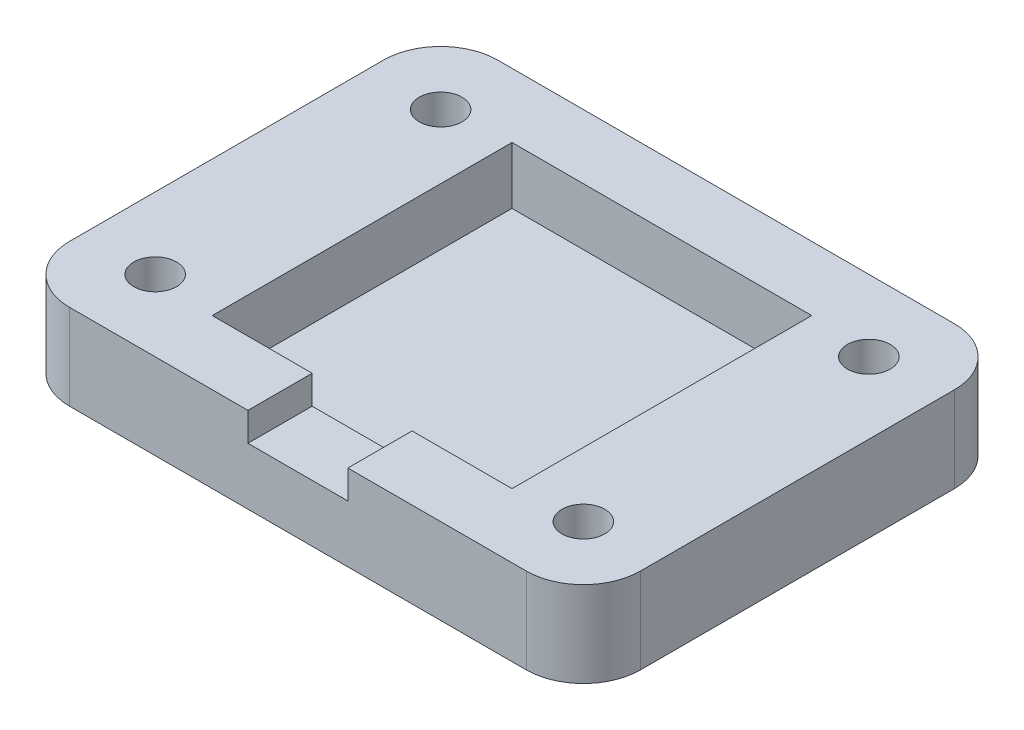
ISO-10303-21;
HEADER;
FILE_DESCRIPTION(('STEP AP214'),'2;1');
FILE_NAME('part.step','',(''),(''),'','','');
FILE_SCHEMA(('AUTOMOTIVE_DESIGN { 1 0 10303 214 1 1 1 1 }'));
ENDSEC;
DATA;
#1=APPLICATION_CONTEXT('core data for automotive mechanical design processes');
#2=APPLICATION_PROTOCOL_DEFINITION('international standard','automotive_design',2000,#1);
#3=PRODUCT_CONTEXT('',#1,'mechanical');
#4=PRODUCT('Part','Part','',(#3));
#5=PRODUCT_RELATED_PRODUCT_CATEGORY('part','',(#4));
#6=PRODUCT_DEFINITION_FORMATION('','',#4);
#7=PRODUCT_DEFINITION_CONTEXT('part definition',#1,'design');
#8=PRODUCT_DEFINITION('design','',#6,#7);
#9=PRODUCT_DEFINITION_SHAPE('','',#8);
#10=(LENGTH_UNIT() NAMED_UNIT(*) SI_UNIT(.MILLI.,.METRE.));
#11=(NAMED_UNIT(*) PLANE_ANGLE_UNIT() SI_UNIT($,.RADIAN.));
#12=(NAMED_UNIT(*) SI_UNIT($,.STERADIAN.) SOLID_ANGLE_UNIT());
#13=UNCERTAINTY_MEASURE_WITH_UNIT(LENGTH_MEASURE(1.E-05),#10,'distance_accuracy_value','');
#14=(GEOMETRIC_REPRESENTATION_CONTEXT(3) GLOBAL_UNCERTAINTY_ASSIGNED_CONTEXT((#13)) GLOBAL_UNIT_ASSIGNED_CONTEXT((#10,
#11,#12)) REPRESENTATION_CONTEXT('',''));
#15=CARTESIAN_POINT('',(0.,0.,0.));
#16=DIRECTION('',(0.,0.,1.));
#17=DIRECTION('',(1.,0.,0.));
#18=AXIS2_PLACEMENT_3D('',#15,#16,#17);
#19=CARTESIAN_POINT('',(0.,6.,0.));
#20=DIRECTION('',(1.,0.,0.));
#21=DIRECTION('',(0.,0.,-1.));
#22=AXIS2_PLACEMENT_3D('',#19,#20,#21);
#23=PLANE('',#22);
#24=DIRECTION('',(0.,0.,1.));
#25=VECTOR('',#24,1.);
#26=CARTESIAN_POINT('',(0.,6.,0.));
#27=LINE('',#26,#25);
#28=CARTESIAN_POINT('',(0.,6.,-26.));
#29=VERTEX_POINT('',#28);
#30=CARTESIAN_POINT('',(0.,6.,-4.));
#31=VERTEX_POINT('',#30);
#32=EDGE_CURVE('E239',#29,#31,#27,.T.);
#33=ORIENTED_EDGE('',*,*,#32,.F.);
#34=DIRECTION('',(0.,-1.,0.));
#35=VECTOR('',#34,1.);
#36=CARTESIAN_POINT('',(0.,6.,-26.));
#37=LINE('',#36,#35);
#38=CARTESIAN_POINT('',(0.,0.,-26.));
#39=VERTEX_POINT('',#38);
#40=EDGE_CURVE('E264',#29,#39,#37,.T.);
#41=ORIENTED_EDGE('',*,*,#40,.T.);
#42=DIRECTION('',(0.,0.,1.));
#43=VECTOR('',#42,1.);
#44=CARTESIAN_POINT('',(0.,0.,0.));
#45=LINE('',#44,#43);
#46=CARTESIAN_POINT('',(0.,0.,-4.));
#47=VERTEX_POINT('',#46);
#48=EDGE_CURVE('E238',#39,#47,#45,.T.);
#49=ORIENTED_EDGE('',*,*,#48,.T.);
#50=DIRECTION('',(0.,-1.,0.));
#51=VECTOR('',#50,1.);
#52=CARTESIAN_POINT('',(0.,6.,-4.));
#53=LINE('',#52,#51);
#54=EDGE_CURVE('E252',#47,#31,#53,.F.);
#55=ORIENTED_EDGE('',*,*,#54,.T.);
#56=EDGE_LOOP('',(#33,#41,#49,#55));
#57=FACE_BOUND('',#56,.T.);
#58=ADVANCED_FACE('F35',(#57),#23,.F.);
#59=CARTESIAN_POINT('',(0.,6.,0.));
#60=DIRECTION('',(0.,0.,-1.));
#61=DIRECTION('',(-1.,0.,0.));
#62=AXIS2_PLACEMENT_3D('',#59,#60,#61);
#63=PLANE('',#62);
#64=DIRECTION('',(1.,0.,0.));
#65=VECTOR('',#64,1.);
#66=CARTESIAN_POINT('',(16.5,4.,0.));
#67=LINE('',#66,#65);
#68=CARTESIAN_POINT('',(16.5,4.,0.));
#69=VERTEX_POINT('',#68);
#70=CARTESIAN_POINT('',(23.5,4.,0.));
#71=VERTEX_POINT('',#70);
#72=EDGE_CURVE('E162',#69,#71,#67,.T.);
#73=ORIENTED_EDGE('',*,*,#72,.F.);
#74=DIRECTION('',(0.,1.,0.));
#75=VECTOR('',#74,1.);
#76=CARTESIAN_POINT('',(16.5,4.,0.));
#77=LINE('',#76,#75);
#78=CARTESIAN_POINT('',(16.5,6.,0.));
#79=VERTEX_POINT('',#78);
#80=EDGE_CURVE('E148',#69,#79,#77,.T.);
#81=ORIENTED_EDGE('',*,*,#80,.T.);
#82=DIRECTION('',(1.,0.,0.));
#83=VECTOR('',#82,1.);
#84=CARTESIAN_POINT('',(0.,6.,0.));
#85=LINE('',#84,#83);
#86=CARTESIAN_POINT('',(4.,6.,0.));
#87=VERTEX_POINT('',#86);
#88=EDGE_CURVE('E244',#87,#79,#85,.T.);
#89=ORIENTED_EDGE('',*,*,#88,.F.);
#90=DIRECTION('',(0.,-1.,0.));
#91=VECTOR('',#90,1.);
#92=CARTESIAN_POINT('',(4.,6.,0.));
#93=LINE('',#92,#91);
#94=CARTESIAN_POINT('',(4.,0.,0.));
#95=VERTEX_POINT('',#94);
#96=EDGE_CURVE('E43',#87,#95,#93,.T.);
#97=ORIENTED_EDGE('',*,*,#96,.T.);
#98=DIRECTION('',(1.,0.,0.));
#99=VECTOR('',#98,1.);
#100=CARTESIAN_POINT('',(0.,0.,0.));
#101=LINE('',#100,#99);
#102=CARTESIAN_POINT('',(36.,0.,0.));
#103=VERTEX_POINT('',#102);
#104=EDGE_CURVE('E255',#95,#103,#101,.T.);
#105=ORIENTED_EDGE('',*,*,#104,.T.);
#106=DIRECTION('',(0.,-1.,0.));
#107=VECTOR('',#106,1.);
#108=CARTESIAN_POINT('',(36.,6.,0.));
#109=LINE('',#108,#107);
#110=CARTESIAN_POINT('',(36.,6.,0.));
#111=VERTEX_POINT('',#110);
#112=EDGE_CURVE('E11',#103,#111,#109,.F.);
#113=ORIENTED_EDGE('',*,*,#112,.T.);
#114=CARTESIAN_POINT('',(23.5,6.,0.));
#115=VERTEX_POINT('',#114);
#116=EDGE_CURVE('E242',#115,#111,#85,.T.);
#117=ORIENTED_EDGE('',*,*,#116,.F.);
#118=DIRECTION('',(0.,1.,0.));
#119=VECTOR('',#118,1.);
#120=CARTESIAN_POINT('',(23.5,4.,0.));
#121=LINE('',#120,#119);
#122=EDGE_CURVE('E158',#71,#115,#121,.T.);
#123=ORIENTED_EDGE('',*,*,#122,.F.);
#124=EDGE_LOOP('',(#73,#81,#89,#97,#105,#113,#117,#123));
#125=FACE_BOUND('',#124,.T.);
#126=ADVANCED_FACE('F168',(#125),#63,.F.);
#127=CARTESIAN_POINT('',(40.,6.,0.));
#128=DIRECTION('',(-1.,0.,0.));
#129=DIRECTION('',(0.,0.,1.));
#130=AXIS2_PLACEMENT_3D('',#127,#128,#129);
#131=PLANE('',#130);
#132=DIRECTION('',(0.,0.,-1.));
#133=VECTOR('',#132,1.);
#134=CARTESIAN_POINT('',(40.,0.,0.));
#135=LINE('',#134,#133);
#136=CARTESIAN_POINT('',(40.,0.,-4.));
#137=VERTEX_POINT('',#136);
#138=CARTESIAN_POINT('',(40.,0.,-26.));
#139=VERTEX_POINT('',#138);
#140=EDGE_CURVE('E258',#137,#139,#135,.T.);
#141=ORIENTED_EDGE('',*,*,#140,.T.);
#142=DIRECTION('',(0.,-1.,0.));
#143=VECTOR('',#142,1.);
#144=CARTESIAN_POINT('',(40.,6.,-26.));
#145=LINE('',#144,#143);
#146=CARTESIAN_POINT('',(40.,6.,-26.));
#147=VERTEX_POINT('',#146);
#148=EDGE_CURVE('E291',#139,#147,#145,.F.);
#149=ORIENTED_EDGE('',*,*,#148,.T.);
#150=DIRECTION('',(0.,0.,-1.));
#151=VECTOR('',#150,1.);
#152=CARTESIAN_POINT('',(40.,6.,0.));
#153=LINE('',#152,#151);
#154=CARTESIAN_POINT('',(40.,6.,-4.));
#155=VERTEX_POINT('',#154);
#156=EDGE_CURVE('E246',#155,#147,#153,.T.);
#157=ORIENTED_EDGE('',*,*,#156,.F.);
#158=DIRECTION('',(0.,-1.,0.));
#159=VECTOR('',#158,1.);
#160=CARTESIAN_POINT('',(40.,6.,-4.));
#161=LINE('',#160,#159);
#162=EDGE_CURVE('E288',#155,#137,#161,.T.);
#163=ORIENTED_EDGE('',*,*,#162,.T.);
#164=EDGE_LOOP('',(#141,#149,#157,#163));
#165=FACE_BOUND('',#164,.T.);
#166=ADVANCED_FACE('F308',(#165),#131,.F.);
#167=CARTESIAN_POINT('',(0.,6.,-30.));
#168=DIRECTION('',(0.,0.,1.));
#169=DIRECTION('',(1.,0.,0.));
#170=AXIS2_PLACEMENT_3D('',#167,#168,#169);
#171=PLANE('',#170);
#172=DIRECTION('',(-1.,0.,0.));
#173=VECTOR('',#172,1.);
#174=CARTESIAN_POINT('',(0.,0.,-30.));
#175=LINE('',#174,#173);
#176=CARTESIAN_POINT('',(36.,0.,-30.));
#177=VERTEX_POINT('',#176);
#178=CARTESIAN_POINT('',(4.,0.,-30.));
#179=VERTEX_POINT('',#178);
#180=EDGE_CURVE('E243',#177,#179,#175,.T.);
#181=ORIENTED_EDGE('',*,*,#180,.T.);
#182=DIRECTION('',(0.,-1.,0.));
#183=VECTOR('',#182,1.);
#184=CARTESIAN_POINT('',(4.,6.,-30.));
#185=LINE('',#184,#183);
#186=CARTESIAN_POINT('',(4.,6.,-30.));
#187=VERTEX_POINT('',#186);
#188=EDGE_CURVE('E278',#179,#187,#185,.F.);
#189=ORIENTED_EDGE('',*,*,#188,.T.);
#190=DIRECTION('',(-1.,0.,0.));
#191=VECTOR('',#190,1.);
#192=CARTESIAN_POINT('',(0.,6.,-30.));
#193=LINE('',#192,#191);
#194=CARTESIAN_POINT('',(36.,6.,-30.));
#195=VERTEX_POINT('',#194);
#196=EDGE_CURVE('E249',#195,#187,#193,.T.);
#197=ORIENTED_EDGE('',*,*,#196,.F.);
#198=DIRECTION('',(0.,-1.,0.));
#199=VECTOR('',#198,1.);
#200=CARTESIAN_POINT('',(36.,6.,-30.));
#201=LINE('',#200,#199);
#202=EDGE_CURVE('E275',#195,#177,#201,.T.);
#203=ORIENTED_EDGE('',*,*,#202,.T.);
#204=EDGE_LOOP('',(#181,#189,#197,#203));
#205=FACE_BOUND('',#204,.T.);
#206=ADVANCED_FACE('F320',(#205),#171,.F.);
#207=CARTESIAN_POINT('',(0.,6.,0.));
#208=DIRECTION('',(0.,-1.,0.));
#209=DIRECTION('',(0.,0.,-1.));
#210=AXIS2_PLACEMENT_3D('',#207,#208,#209);
#211=PLANE('',#210);
#212=ORIENTED_EDGE('',*,*,#88,.T.);
#213=DIRECTION('',(0.,0.,1.));
#214=VECTOR('',#213,1.);
#215=CARTESIAN_POINT('',(16.5,6.,-4.5));
#216=LINE('',#215,#214);
#217=CARTESIAN_POINT('',(16.5,6.,-4.5));
#218=VERTEX_POINT('',#217);
#219=EDGE_CURVE('E153',#218,#79,#216,.T.);
#220=ORIENTED_EDGE('',*,*,#219,.F.);
#221=DIRECTION('',(1.,0.,0.));
#222=VECTOR('',#221,1.);
#223=CARTESIAN_POINT('',(9.5,6.,-4.5));
#224=LINE('',#223,#222);
#225=CARTESIAN_POINT('',(9.5,6.,-4.5));
#226=VERTEX_POINT('',#225);
#227=EDGE_CURVE('E198',#226,#218,#224,.T.);
#228=ORIENTED_EDGE('',*,*,#227,.F.);
#229=DIRECTION('',(0.,0.,1.));
#230=VECTOR('',#229,1.);
#231=CARTESIAN_POINT('',(9.5,6.,-4.5));
#232=LINE('',#231,#230);
#233=CARTESIAN_POINT('',(9.5,6.,-25.5));
#234=VERTEX_POINT('',#233);
#235=EDGE_CURVE('E58',#234,#226,#232,.T.);
#236=ORIENTED_EDGE('',*,*,#235,.F.);
#237=DIRECTION('',(-1.,0.,0.));
#238=VECTOR('',#237,1.);
#239=CARTESIAN_POINT('',(9.5,6.,-25.5));
#240=LINE('',#239,#238);
#241=CARTESIAN_POINT('',(30.5,6.,-25.5));
#242=VERTEX_POINT('',#241);
#243=EDGE_CURVE('E186',#242,#234,#240,.T.);
#244=ORIENTED_EDGE('',*,*,#243,.F.);
#245=DIRECTION('',(0.,0.,-1.));
#246=VECTOR('',#245,1.);
#247=CARTESIAN_POINT('',(30.5,6.,-4.5));
#248=LINE('',#247,#246);
#249=CARTESIAN_POINT('',(30.5,6.,-4.5));
#250=VERTEX_POINT('',#249);
#251=EDGE_CURVE('E201',#250,#242,#248,.T.);
#252=ORIENTED_EDGE('',*,*,#251,.F.);
#253=CARTESIAN_POINT('',(23.5,6.,-4.5));
#254=VERTEX_POINT('',#253);
#255=EDGE_CURVE('E197',#254,#250,#224,.T.);
#256=ORIENTED_EDGE('',*,*,#255,.F.);
#257=DIRECTION('',(0.,0.,-1.));
#258=VECTOR('',#257,1.);
#259=CARTESIAN_POINT('',(23.5,6.,-4.5));
#260=LINE('',#259,#258);
#261=EDGE_CURVE('E166',#115,#254,#260,.T.);
#262=ORIENTED_EDGE('',*,*,#261,.F.);
#263=ORIENTED_EDGE('',*,*,#116,.T.);
#264=CARTESIAN_POINT('',(36.,6.,-4.));
#265=DIRECTION('',(0.,-1.,0.));
#266=DIRECTION('',(0.,0.,-1.));
#267=AXIS2_PLACEMENT_3D('',#264,#265,#266);
#268=CIRCLE('',#267,4.);
#269=EDGE_CURVE('E282',#111,#155,#268,.F.);
#270=ORIENTED_EDGE('',*,*,#269,.T.);
#271=ORIENTED_EDGE('',*,*,#156,.T.);
#272=CARTESIAN_POINT('',(36.,6.,-26.));
#273=DIRECTION('',(0.,-1.,0.));
#274=DIRECTION('',(0.,0.,-1.));
#275=AXIS2_PLACEMENT_3D('',#272,#273,#274);
#276=CIRCLE('',#275,4.);
#277=EDGE_CURVE('E284',#147,#195,#276,.F.);
#278=ORIENTED_EDGE('',*,*,#277,.T.);
#279=ORIENTED_EDGE('',*,*,#196,.T.);
#280=CARTESIAN_POINT('',(4.,6.,-26.));
#281=DIRECTION('',(0.,-1.,0.));
#282=DIRECTION('',(0.,0.,-1.));
#283=AXIS2_PLACEMENT_3D('',#280,#281,#282);
#284=CIRCLE('',#283,4.);
#285=EDGE_CURVE('E286',#187,#29,#284,.F.);
#286=ORIENTED_EDGE('',*,*,#285,.T.);
#287=ORIENTED_EDGE('',*,*,#32,.T.);
#288=CARTESIAN_POINT('',(4.,6.,-4.));
#289=DIRECTION('',(0.,-1.,0.));
#290=DIRECTION('',(0.,0.,-1.));
#291=AXIS2_PLACEMENT_3D('',#288,#289,#290);
#292=CIRCLE('',#291,4.);
#293=EDGE_CURVE('E280',#31,#87,#292,.F.);
#294=ORIENTED_EDGE('',*,*,#293,.T.);
#295=EDGE_LOOP('',(#212,#220,#228,#236,#244,#252,#256,#262,#263,#270,#271,#278,#279,#286,#287,#294));
#296=FACE_BOUND('',#295,.T.);
#297=CARTESIAN_POINT('',(5.,6.,-25.));
#298=DIRECTION('',(0.,1.,0.));
#299=DIRECTION('',(0.,0.,-1.));
#300=AXIS2_PLACEMENT_3D('',#297,#298,#299);
#301=CIRCLE('',#300,1.5);
#302=CARTESIAN_POINT('',(5.,6.,-26.5));
#303=VERTEX_POINT('',#302);
#304=EDGE_CURVE('E215',#303,#303,#301,.T.);
#305=ORIENTED_EDGE('',*,*,#304,.F.);
#306=EDGE_LOOP('',(#305));
#307=FACE_BOUND('',#306,.T.);
#308=CARTESIAN_POINT('',(35.,6.,-5.));
#309=DIRECTION('',(0.,1.,0.));
#310=DIRECTION('',(0.,0.,-1.));
#311=AXIS2_PLACEMENT_3D('',#308,#309,#310);
#312=CIRCLE('',#311,1.5);
#313=CARTESIAN_POINT('',(35.,6.,-6.5));
#314=VERTEX_POINT('',#313);
#315=EDGE_CURVE('E223',#314,#314,#312,.T.);
#316=ORIENTED_EDGE('',*,*,#315,.F.);
#317=EDGE_LOOP('',(#316));
#318=FACE_BOUND('',#317,.T.);
#319=CARTESIAN_POINT('',(35.,6.,-25.));
#320=DIRECTION('',(0.,1.,0.));
#321=DIRECTION('',(0.,0.,1.));
#322=AXIS2_PLACEMENT_3D('',#319,#320,#321);
#323=CIRCLE('',#322,1.5);
#324=CARTESIAN_POINT('',(35.,6.,-23.5));
#325=VERTEX_POINT('',#324);
#326=EDGE_CURVE('E208',#325,#325,#323,.T.);
#327=ORIENTED_EDGE('',*,*,#326,.F.);
#328=EDGE_LOOP('',(#327));
#329=FACE_BOUND('',#328,.T.);
#330=CARTESIAN_POINT('',(5.,6.,-5.));
#331=DIRECTION('',(0.,1.,0.));
#332=DIRECTION('',(0.,0.,1.));
#333=AXIS2_PLACEMENT_3D('',#330,#331,#332);
#334=CIRCLE('',#333,1.5);
#335=CARTESIAN_POINT('',(5.,6.,-3.5));
#336=VERTEX_POINT('',#335);
#337=EDGE_CURVE('E222',#336,#336,#334,.T.);
#338=ORIENTED_EDGE('',*,*,#337,.F.);
#339=EDGE_LOOP('',(#338));
#340=FACE_BOUND('',#339,.T.);
#341=ADVANCED_FACE('F312',(#296,#307,#318,#329,#340),#211,.F.);
#342=CARTESIAN_POINT('',(0.,0.,0.));
#343=DIRECTION('',(0.,-1.,0.));
#344=DIRECTION('',(0.,0.,-1.));
#345=AXIS2_PLACEMENT_3D('',#342,#343,#344);
#346=PLANE('',#345);
#347=CARTESIAN_POINT('',(5.,0.,-25.));
#348=DIRECTION('',(0.,-1.,0.));
#349=DIRECTION('',(0.,0.,-1.));
#350=AXIS2_PLACEMENT_3D('',#347,#348,#349);
#351=CIRCLE('',#350,1.5);
#352=CARTESIAN_POINT('',(5.,0.,-26.5));
#353=VERTEX_POINT('',#352);
#354=EDGE_CURVE('E218',#353,#353,#351,.F.);
#355=ORIENTED_EDGE('',*,*,#354,.T.);
#356=EDGE_LOOP('',(#355));
#357=FACE_BOUND('',#356,.T.);
#358=CARTESIAN_POINT('',(35.,0.,-5.));
#359=DIRECTION('',(0.,-1.,0.));
#360=DIRECTION('',(0.,0.,-1.));
#361=AXIS2_PLACEMENT_3D('',#358,#359,#360);
#362=CIRCLE('',#361,1.5);
#363=CARTESIAN_POINT('',(35.,0.,-6.5));
#364=VERTEX_POINT('',#363);
#365=EDGE_CURVE('E219',#364,#364,#362,.F.);
#366=ORIENTED_EDGE('',*,*,#365,.T.);
#367=EDGE_LOOP('',(#366));
#368=FACE_BOUND('',#367,.T.);
#369=CARTESIAN_POINT('',(35.,0.,-25.));
#370=DIRECTION('',(0.,-1.,0.));
#371=DIRECTION('',(0.,0.,-1.));
#372=AXIS2_PLACEMENT_3D('',#369,#370,#371);
#373=CIRCLE('',#372,1.5);
#374=CARTESIAN_POINT('',(35.,0.,-26.5));
#375=VERTEX_POINT('',#374);
#376=EDGE_CURVE('E226',#375,#375,#373,.F.);
#377=ORIENTED_EDGE('',*,*,#376,.T.);
#378=EDGE_LOOP('',(#377));
#379=FACE_BOUND('',#378,.T.);
#380=CARTESIAN_POINT('',(5.,0.,-5.));
#381=DIRECTION('',(0.,-1.,0.));
#382=DIRECTION('',(0.,0.,-1.));
#383=AXIS2_PLACEMENT_3D('',#380,#381,#382);
#384=CIRCLE('',#383,1.5);
#385=CARTESIAN_POINT('',(5.,0.,-6.5));
#386=VERTEX_POINT('',#385);
#387=EDGE_CURVE('E235',#386,#386,#384,.F.);
#388=ORIENTED_EDGE('',*,*,#387,.T.);
#389=EDGE_LOOP('',(#388));
#390=FACE_BOUND('',#389,.T.);
#391=ORIENTED_EDGE('',*,*,#48,.F.);
#392=CARTESIAN_POINT('',(4.,0.,-26.));
#393=DIRECTION('',(0.,-1.,0.));
#394=DIRECTION('',(0.,0.,-1.));
#395=AXIS2_PLACEMENT_3D('',#392,#393,#394);
#396=CIRCLE('',#395,4.);
#397=EDGE_CURVE('E273',#39,#179,#396,.T.);
#398=ORIENTED_EDGE('',*,*,#397,.T.);
#399=ORIENTED_EDGE('',*,*,#180,.F.);
#400=CARTESIAN_POINT('',(36.,0.,-26.));
#401=DIRECTION('',(0.,-1.,0.));
#402=DIRECTION('',(0.,0.,-1.));
#403=AXIS2_PLACEMENT_3D('',#400,#401,#402);
#404=CIRCLE('',#403,4.);
#405=EDGE_CURVE('E271',#177,#139,#404,.T.);
#406=ORIENTED_EDGE('',*,*,#405,.T.);
#407=ORIENTED_EDGE('',*,*,#140,.F.);
#408=CARTESIAN_POINT('',(36.,0.,-4.));
#409=DIRECTION('',(0.,-1.,0.));
#410=DIRECTION('',(0.,0.,-1.));
#411=AXIS2_PLACEMENT_3D('',#408,#409,#410);
#412=CIRCLE('',#411,4.);
#413=EDGE_CURVE('E269',#137,#103,#412,.T.);
#414=ORIENTED_EDGE('',*,*,#413,.T.);
#415=ORIENTED_EDGE('',*,*,#104,.F.);
#416=CARTESIAN_POINT('',(4.,0.,-4.));
#417=DIRECTION('',(0.,-1.,0.));
#418=DIRECTION('',(0.,0.,-1.));
#419=AXIS2_PLACEMENT_3D('',#416,#417,#418);
#420=CIRCLE('',#419,4.);
#421=EDGE_CURVE('E267',#95,#47,#420,.T.);
#422=ORIENTED_EDGE('',*,*,#421,.T.);
#423=EDGE_LOOP('',(#391,#398,#399,#406,#407,#414,#415,#422));
#424=FACE_BOUND('',#423,.T.);
#425=ADVANCED_FACE('F300',(#357,#368,#379,#390,#424),#346,.T.);
#426=CARTESIAN_POINT('',(5.,-4.24264068711928,-5.));
#427=DIRECTION('',(0.,1.,0.));
#428=DIRECTION('',(0.,0.,1.));
#429=AXIS2_PLACEMENT_3D('',#426,#427,#428);
#430=CYLINDRICAL_SURFACE('',#429,1.5);
#431=ORIENTED_EDGE('',*,*,#337,.T.);
#432=EDGE_LOOP('',(#431));
#433=FACE_BOUND('',#432,.T.);
#434=ORIENTED_EDGE('',*,*,#387,.F.);
#435=EDGE_LOOP('',(#434));
#436=FACE_BOUND('',#435,.T.);
#437=ADVANCED_FACE('F458',(#433,#436),#430,.F.);
#438=CARTESIAN_POINT('',(35.,-4.24264068711928,-25.));
#439=DIRECTION('',(0.,1.,0.));
#440=DIRECTION('',(0.,0.,1.));
#441=AXIS2_PLACEMENT_3D('',#438,#439,#440);
#442=CYLINDRICAL_SURFACE('',#441,1.5);
#443=ORIENTED_EDGE('',*,*,#326,.T.);
#444=EDGE_LOOP('',(#443));
#445=FACE_BOUND('',#444,.T.);
#446=ORIENTED_EDGE('',*,*,#376,.F.);
#447=EDGE_LOOP('',(#446));
#448=FACE_BOUND('',#447,.T.);
#449=ADVANCED_FACE('F454',(#445,#448),#442,.F.);
#450=CARTESIAN_POINT('',(35.,-4.24264068711928,-5.));
#451=DIRECTION('',(0.,1.,0.));
#452=DIRECTION('',(0.,0.,1.));
#453=AXIS2_PLACEMENT_3D('',#450,#451,#452);
#454=CYLINDRICAL_SURFACE('',#453,1.5);
#455=ORIENTED_EDGE('',*,*,#315,.T.);
#456=EDGE_LOOP('',(#455));
#457=FACE_BOUND('',#456,.T.);
#458=ORIENTED_EDGE('',*,*,#365,.F.);
#459=EDGE_LOOP('',(#458));
#460=FACE_BOUND('',#459,.T.);
#461=ADVANCED_FACE('F450',(#457,#460),#454,.F.);
#462=CARTESIAN_POINT('',(5.,-4.24264068711928,-25.));
#463=DIRECTION('',(0.,1.,0.));
#464=DIRECTION('',(0.,0.,1.));
#465=AXIS2_PLACEMENT_3D('',#462,#463,#464);
#466=CYLINDRICAL_SURFACE('',#465,1.5);
#467=ORIENTED_EDGE('',*,*,#304,.T.);
#468=EDGE_LOOP('',(#467));
#469=FACE_BOUND('',#468,.T.);
#470=ORIENTED_EDGE('',*,*,#354,.F.);
#471=EDGE_LOOP('',(#470));
#472=FACE_BOUND('',#471,.T.);
#473=ADVANCED_FACE('F348',(#469,#472),#466,.F.);
#474=CARTESIAN_POINT('',(4.,6.,-26.));
#475=DIRECTION('',(0.,-1.,0.));
#476=DIRECTION('',(0.,0.,-1.));
#477=AXIS2_PLACEMENT_3D('',#474,#475,#476);
#478=CYLINDRICAL_SURFACE('',#477,4.);
#479=ORIENTED_EDGE('',*,*,#285,.F.);
#480=ORIENTED_EDGE('',*,*,#188,.F.);
#481=ORIENTED_EDGE('',*,*,#397,.F.);
#482=ORIENTED_EDGE('',*,*,#40,.F.);
#483=EDGE_LOOP('',(#479,#480,#481,#482));
#484=FACE_BOUND('',#483,.T.);
#485=ADVANCED_FACE('F325',(#484),#478,.T.);
#486=CARTESIAN_POINT('',(36.,6.,-26.));
#487=DIRECTION('',(0.,-1.,0.));
#488=DIRECTION('',(0.,0.,-1.));
#489=AXIS2_PLACEMENT_3D('',#486,#487,#488);
#490=CYLINDRICAL_SURFACE('',#489,4.);
#491=ORIENTED_EDGE('',*,*,#277,.F.);
#492=ORIENTED_EDGE('',*,*,#148,.F.);
#493=ORIENTED_EDGE('',*,*,#405,.F.);
#494=ORIENTED_EDGE('',*,*,#202,.F.);
#495=EDGE_LOOP('',(#491,#492,#493,#494));
#496=FACE_BOUND('',#495,.T.);
#497=ADVANCED_FACE('F317',(#496),#490,.T.);
#498=CARTESIAN_POINT('',(36.,6.,-4.));
#499=DIRECTION('',(0.,-1.,0.));
#500=DIRECTION('',(0.,0.,-1.));
#501=AXIS2_PLACEMENT_3D('',#498,#499,#500);
#502=CYLINDRICAL_SURFACE('',#501,4.);
#503=ORIENTED_EDGE('',*,*,#269,.F.);
#504=ORIENTED_EDGE('',*,*,#112,.F.);
#505=ORIENTED_EDGE('',*,*,#413,.F.);
#506=ORIENTED_EDGE('',*,*,#162,.F.);
#507=EDGE_LOOP('',(#503,#504,#505,#506));
#508=FACE_BOUND('',#507,.T.);
#509=ADVANCED_FACE('F305',(#508),#502,.T.);
#510=CARTESIAN_POINT('',(4.,6.,-4.));
#511=DIRECTION('',(0.,-1.,0.));
#512=DIRECTION('',(0.,0.,-1.));
#513=AXIS2_PLACEMENT_3D('',#510,#511,#512);
#514=CYLINDRICAL_SURFACE('',#513,4.);
#515=ORIENTED_EDGE('',*,*,#293,.F.);
#516=ORIENTED_EDGE('',*,*,#54,.F.);
#517=ORIENTED_EDGE('',*,*,#421,.F.);
#518=ORIENTED_EDGE('',*,*,#96,.F.);
#519=EDGE_LOOP('',(#515,#516,#517,#518));
#520=FACE_BOUND('',#519,.T.);
#521=ADVANCED_FACE('F37',(#520),#514,.T.);
#522=CARTESIAN_POINT('',(9.5,2.,-4.5));
#523=DIRECTION('',(-1.,0.,0.));
#524=DIRECTION('',(0.,0.,1.));
#525=AXIS2_PLACEMENT_3D('',#522,#523,#524);
#526=PLANE('',#525);
#527=ORIENTED_EDGE('',*,*,#235,.T.);
#528=DIRECTION('',(0.,1.,0.));
#529=VECTOR('',#528,1.);
#530=CARTESIAN_POINT('',(9.5,2.,-4.5));
#531=LINE('',#530,#529);
#532=CARTESIAN_POINT('',(9.5,2.,-4.5));
#533=VERTEX_POINT('',#532);
#534=EDGE_CURVE('E195',#533,#226,#531,.T.);
#535=ORIENTED_EDGE('',*,*,#534,.F.);
#536=DIRECTION('',(0.,0.,1.));
#537=VECTOR('',#536,1.);
#538=CARTESIAN_POINT('',(9.5,2.,-4.5));
#539=LINE('',#538,#537);
#540=CARTESIAN_POINT('',(9.5,2.,-25.5));
#541=VERTEX_POINT('',#540);
#542=EDGE_CURVE('E182',#541,#533,#539,.T.);
#543=ORIENTED_EDGE('',*,*,#542,.F.);
#544=DIRECTION('',(0.,1.,0.));
#545=VECTOR('',#544,1.);
#546=CARTESIAN_POINT('',(9.5,2.,-25.5));
#547=LINE('',#546,#545);
#548=EDGE_CURVE('E206',#541,#234,#547,.T.);
#549=ORIENTED_EDGE('',*,*,#548,.T.);
#550=EDGE_LOOP('',(#527,#535,#543,#549));
#551=FACE_BOUND('',#550,.T.);
#552=ADVANCED_FACE('F330',(#551),#526,.F.);
#553=CARTESIAN_POINT('',(9.5,2.,-25.5));
#554=DIRECTION('',(0.,0.,-1.));
#555=DIRECTION('',(-1.,0.,0.));
#556=AXIS2_PLACEMENT_3D('',#553,#554,#555);
#557=PLANE('',#556);
#558=ORIENTED_EDGE('',*,*,#243,.T.);
#559=ORIENTED_EDGE('',*,*,#548,.F.);
#560=DIRECTION('',(-1.,0.,0.));
#561=VECTOR('',#560,1.);
#562=CARTESIAN_POINT('',(9.5,2.,-25.5));
#563=LINE('',#562,#561);
#564=CARTESIAN_POINT('',(30.5,2.,-25.5));
#565=VERTEX_POINT('',#564);
#566=EDGE_CURVE('E192',#565,#541,#563,.T.);
#567=ORIENTED_EDGE('',*,*,#566,.F.);
#568=DIRECTION('',(0.,1.,0.));
#569=VECTOR('',#568,1.);
#570=CARTESIAN_POINT('',(30.5,2.,-25.5));
#571=LINE('',#570,#569);
#572=EDGE_CURVE('E209',#565,#242,#571,.T.);
#573=ORIENTED_EDGE('',*,*,#572,.T.);
#574=EDGE_LOOP('',(#558,#559,#567,#573));
#575=FACE_BOUND('',#574,.T.);
#576=ADVANCED_FACE('F335',(#575),#557,.F.);
#577=CARTESIAN_POINT('',(30.5,2.,-4.5));
#578=DIRECTION('',(1.,0.,0.));
#579=DIRECTION('',(0.,0.,-1.));
#580=AXIS2_PLACEMENT_3D('',#577,#578,#579);
#581=PLANE('',#580);
#582=ORIENTED_EDGE('',*,*,#251,.T.);
#583=ORIENTED_EDGE('',*,*,#572,.F.);
#584=DIRECTION('',(0.,0.,-1.));
#585=VECTOR('',#584,1.);
#586=CARTESIAN_POINT('',(30.5,2.,-4.5));
#587=LINE('',#586,#585);
#588=CARTESIAN_POINT('',(30.5,2.,-4.5));
#589=VERTEX_POINT('',#588);
#590=EDGE_CURVE('E189',#589,#565,#587,.T.);
#591=ORIENTED_EDGE('',*,*,#590,.F.);
#592=DIRECTION('',(0.,1.,0.));
#593=VECTOR('',#592,1.);
#594=CARTESIAN_POINT('',(30.5,2.,-4.5));
#595=LINE('',#594,#593);
#596=EDGE_CURVE('E211',#589,#250,#595,.T.);
#597=ORIENTED_EDGE('',*,*,#596,.T.);
#598=EDGE_LOOP('',(#582,#583,#591,#597));
#599=FACE_BOUND('',#598,.T.);
#600=ADVANCED_FACE('F378',(#599),#581,.F.);
#601=CARTESIAN_POINT('',(9.5,2.,-4.5));
#602=DIRECTION('',(0.,0.,1.));
#603=DIRECTION('',(1.,0.,0.));
#604=AXIS2_PLACEMENT_3D('',#601,#602,#603);
#605=PLANE('',#604);
#606=ORIENTED_EDGE('',*,*,#227,.T.);
#607=DIRECTION('',(0.,1.,0.));
#608=VECTOR('',#607,1.);
#609=CARTESIAN_POINT('',(16.5,4.,-4.5));
#610=LINE('',#609,#608);
#611=CARTESIAN_POINT('',(16.5,4.,-4.5));
#612=VERTEX_POINT('',#611);
#613=EDGE_CURVE('E176',#612,#218,#610,.T.);
#614=ORIENTED_EDGE('',*,*,#613,.F.);
#615=DIRECTION('',(-1.,0.,0.));
#616=VECTOR('',#615,1.);
#617=CARTESIAN_POINT('',(16.5,4.,-4.5));
#618=LINE('',#617,#616);
#619=CARTESIAN_POINT('',(23.5,4.,-4.5));
#620=VERTEX_POINT('',#619);
#621=EDGE_CURVE('E159',#620,#612,#618,.T.);
#622=ORIENTED_EDGE('',*,*,#621,.F.);
#623=DIRECTION('',(0.,1.,0.));
#624=VECTOR('',#623,1.);
#625=CARTESIAN_POINT('',(23.5,4.,-4.5));
#626=LINE('',#625,#624);
#627=EDGE_CURVE('E178',#620,#254,#626,.T.);
#628=ORIENTED_EDGE('',*,*,#627,.T.);
#629=ORIENTED_EDGE('',*,*,#255,.T.);
#630=ORIENTED_EDGE('',*,*,#596,.F.);
#631=DIRECTION('',(1.,0.,0.));
#632=VECTOR('',#631,1.);
#633=CARTESIAN_POINT('',(9.5,2.,-4.5));
#634=LINE('',#633,#632);
#635=EDGE_CURVE('E185',#533,#589,#634,.T.);
#636=ORIENTED_EDGE('',*,*,#635,.F.);
#637=ORIENTED_EDGE('',*,*,#534,.T.);
#638=EDGE_LOOP('',(#606,#614,#622,#628,#629,#630,#636,#637));
#639=FACE_BOUND('',#638,.T.);
#640=ADVANCED_FACE('F388',(#639),#605,.F.);
#641=CARTESIAN_POINT('',(0.,2.,0.));
#642=DIRECTION('',(0.,-1.,0.));
#643=DIRECTION('',(0.,0.,-1.));
#644=AXIS2_PLACEMENT_3D('',#641,#642,#643);
#645=PLANE('',#644);
#646=ORIENTED_EDGE('',*,*,#542,.T.);
#647=ORIENTED_EDGE('',*,*,#635,.T.);
#648=ORIENTED_EDGE('',*,*,#590,.T.);
#649=ORIENTED_EDGE('',*,*,#566,.T.);
#650=EDGE_LOOP('',(#646,#647,#648,#649));
#651=FACE_BOUND('',#650,.T.);
#652=ADVANCED_FACE('F396',(#651),#645,.F.);
#653=CARTESIAN_POINT('',(16.5,4.,-4.5));
#654=DIRECTION('',(-1.,0.,0.));
#655=DIRECTION('',(0.,0.,1.));
#656=AXIS2_PLACEMENT_3D('',#653,#654,#655);
#657=PLANE('',#656);
#658=ORIENTED_EDGE('',*,*,#219,.T.);
#659=ORIENTED_EDGE('',*,*,#80,.F.);
#660=DIRECTION('',(0.,0.,1.));
#661=VECTOR('',#660,1.);
#662=CARTESIAN_POINT('',(16.5,4.,-4.5));
#663=LINE('',#662,#661);
#664=EDGE_CURVE('E151',#612,#69,#663,.T.);
#665=ORIENTED_EDGE('',*,*,#664,.F.);
#666=ORIENTED_EDGE('',*,*,#613,.T.);
#667=EDGE_LOOP('',(#658,#659,#665,#666));
#668=FACE_BOUND('',#667,.T.);
#669=ADVANCED_FACE('F150',(#668),#657,.F.);
#670=CARTESIAN_POINT('',(23.5,4.,-4.5));
#671=DIRECTION('',(1.,0.,0.));
#672=DIRECTION('',(0.,0.,-1.));
#673=AXIS2_PLACEMENT_3D('',#670,#671,#672);
#674=PLANE('',#673);
#675=ORIENTED_EDGE('',*,*,#261,.T.);
#676=ORIENTED_EDGE('',*,*,#627,.F.);
#677=DIRECTION('',(0.,0.,-1.));
#678=VECTOR('',#677,1.);
#679=CARTESIAN_POINT('',(23.5,4.,-4.5));
#680=LINE('',#679,#678);
#681=EDGE_CURVE('E50',#71,#620,#680,.T.);
#682=ORIENTED_EDGE('',*,*,#681,.F.);
#683=ORIENTED_EDGE('',*,*,#122,.T.);
#684=EDGE_LOOP('',(#675,#676,#682,#683));
#685=FACE_BOUND('',#684,.T.);
#686=ADVANCED_FACE('F427',(#685),#674,.F.);
#687=CARTESIAN_POINT('',(0.,4.,0.));
#688=DIRECTION('',(0.,1.,0.));
#689=DIRECTION('',(0.,0.,1.));
#690=AXIS2_PLACEMENT_3D('',#687,#688,#689);
#691=PLANE('',#690);
#692=ORIENTED_EDGE('',*,*,#664,.T.);
#693=ORIENTED_EDGE('',*,*,#72,.T.);
#694=ORIENTED_EDGE('',*,*,#681,.T.);
#695=ORIENTED_EDGE('',*,*,#621,.T.);
#696=EDGE_LOOP('',(#692,#693,#694,#695));
#697=FACE_BOUND('',#696,.T.);
#698=ADVANCED_FACE('F161',(#697),#691,.T.);
#699=CLOSED_SHELL('',(#58,#126,#166,#206,#341,#425,#437,#449,#461,#473,#485,#497,#509,#521,#552,
#576,#600,#640,#652,#669,#686,#698));
#700=MANIFOLD_SOLID_BREP('B2',#699);
#701=ADVANCED_BREP_SHAPE_REPRESENTATION('',(#18,#700),#14);
#702=SHAPE_DEFINITION_REPRESENTATION(#9,#701);
ENDSEC;
END-ISO-10303-21;
